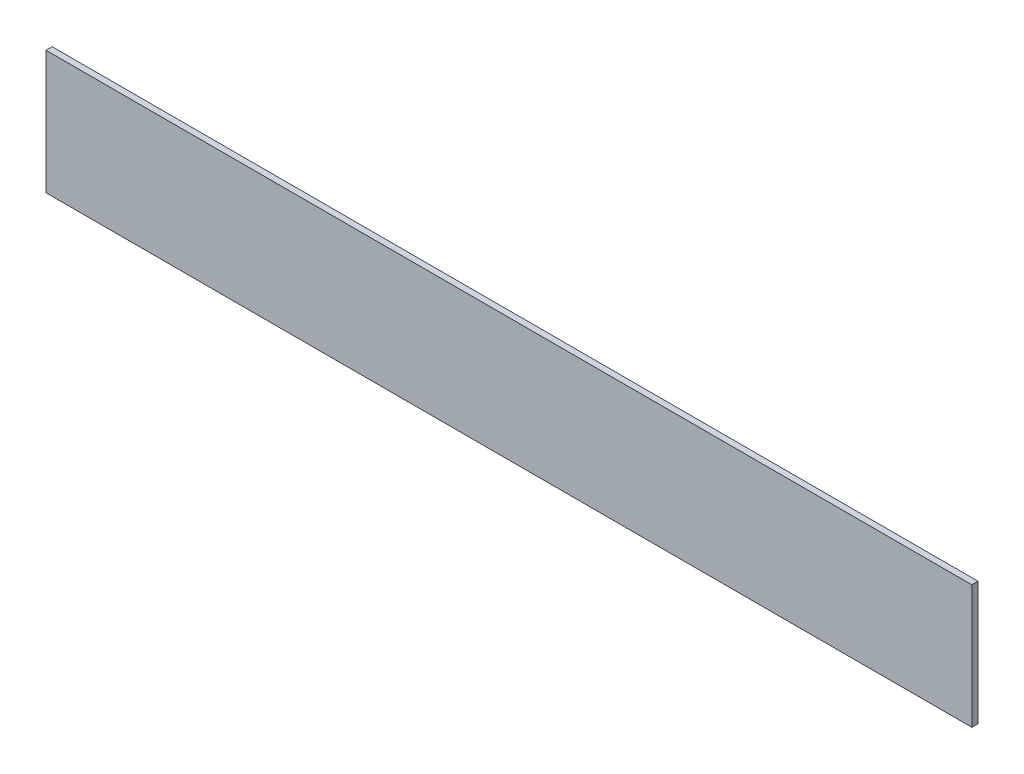
ISO-10303-21;
HEADER;
FILE_DESCRIPTION(('STEP AP214'),'2;1');
FILE_NAME('part.step','',(''),(''),'','','');
FILE_SCHEMA(('AUTOMOTIVE_DESIGN { 1 0 10303 214 1 1 1 1 }'));
ENDSEC;
DATA;
#1=APPLICATION_CONTEXT('core data for automotive mechanical design processes');
#2=APPLICATION_PROTOCOL_DEFINITION('international standard','automotive_design',2000,#1);
#3=PRODUCT_CONTEXT('',#1,'mechanical');
#4=PRODUCT('Part','Part','',(#3));
#5=PRODUCT_RELATED_PRODUCT_CATEGORY('part','',(#4));
#6=PRODUCT_DEFINITION_FORMATION('','',#4);
#7=PRODUCT_DEFINITION_CONTEXT('part definition',#1,'design');
#8=PRODUCT_DEFINITION('design','',#6,#7);
#9=PRODUCT_DEFINITION_SHAPE('','',#8);
#10=(LENGTH_UNIT() NAMED_UNIT(*) SI_UNIT(.MILLI.,.METRE.));
#11=(NAMED_UNIT(*) PLANE_ANGLE_UNIT() SI_UNIT($,.RADIAN.));
#12=(NAMED_UNIT(*) SI_UNIT($,.STERADIAN.) SOLID_ANGLE_UNIT());
#13=UNCERTAINTY_MEASURE_WITH_UNIT(LENGTH_MEASURE(1.E-05),#10,'distance_accuracy_value','');
#14=(GEOMETRIC_REPRESENTATION_CONTEXT(3) GLOBAL_UNCERTAINTY_ASSIGNED_CONTEXT((#13)) GLOBAL_UNIT_ASSIGNED_CONTEXT((#10,
#11,#12)) REPRESENTATION_CONTEXT('',''));
#15=CARTESIAN_POINT('',(0.,0.,0.));
#16=DIRECTION('',(0.,0.,1.));
#17=DIRECTION('',(1.,0.,0.));
#18=AXIS2_PLACEMENT_3D('',#15,#16,#17);
#19=CARTESIAN_POINT('',(150.,-20.,-1.));
#20=DIRECTION('',(1.,0.,0.));
#21=DIRECTION('',(0.,0.,-1.));
#22=AXIS2_PLACEMENT_3D('',#19,#20,#21);
#23=PLANE('',#22);
#24=DIRECTION('',(0.,0.,1.));
#25=VECTOR('',#24,1.);
#26=CARTESIAN_POINT('',(150.,20.,-1.));
#27=LINE('',#26,#25);
#28=CARTESIAN_POINT('',(150.,20.,-1.));
#29=VERTEX_POINT('',#28);
#30=CARTESIAN_POINT('',(150.,20.,1.));
#31=VERTEX_POINT('',#30);
#32=EDGE_CURVE('E40',#29,#31,#27,.T.);
#33=ORIENTED_EDGE('',*,*,#32,.T.);
#34=DIRECTION('',(0.,1.,0.));
#35=VECTOR('',#34,1.);
#36=CARTESIAN_POINT('',(150.,-20.,1.));
#37=LINE('',#36,#35);
#38=CARTESIAN_POINT('',(150.,-20.,1.));
#39=VERTEX_POINT('',#38);
#40=EDGE_CURVE('E77',#39,#31,#37,.T.);
#41=ORIENTED_EDGE('',*,*,#40,.F.);
#42=DIRECTION('',(0.,0.,1.));
#43=VECTOR('',#42,1.);
#44=CARTESIAN_POINT('',(150.,-20.,-1.));
#45=LINE('',#44,#43);
#46=CARTESIAN_POINT('',(150.,-20.,-1.));
#47=VERTEX_POINT('',#46);
#48=EDGE_CURVE('E11',#47,#39,#45,.T.);
#49=ORIENTED_EDGE('',*,*,#48,.F.);
#50=DIRECTION('',(0.,1.,0.));
#51=VECTOR('',#50,1.);
#52=CARTESIAN_POINT('',(150.,-20.,-1.));
#53=LINE('',#52,#51);
#54=EDGE_CURVE('E78',#47,#29,#53,.T.);
#55=ORIENTED_EDGE('',*,*,#54,.T.);
#56=EDGE_LOOP('',(#33,#41,#49,#55));
#57=FACE_BOUND('',#56,.T.);
#58=ADVANCED_FACE('F37',(#57),#23,.T.);
#59=CARTESIAN_POINT('',(-150.,-20.,-1.));
#60=DIRECTION('',(0.,-1.,0.));
#61=DIRECTION('',(0.,0.,-1.));
#62=AXIS2_PLACEMENT_3D('',#59,#60,#61);
#63=PLANE('',#62);
#64=ORIENTED_EDGE('',*,*,#48,.T.);
#65=DIRECTION('',(1.,0.,0.));
#66=VECTOR('',#65,1.);
#67=CARTESIAN_POINT('',(-150.,-20.,1.));
#68=LINE('',#67,#66);
#69=CARTESIAN_POINT('',(-150.,-20.,1.));
#70=VERTEX_POINT('',#69);
#71=EDGE_CURVE('E94',#70,#39,#68,.T.);
#72=ORIENTED_EDGE('',*,*,#71,.F.);
#73=DIRECTION('',(0.,0.,1.));
#74=VECTOR('',#73,1.);
#75=CARTESIAN_POINT('',(-150.,-20.,-1.));
#76=LINE('',#75,#74);
#77=CARTESIAN_POINT('',(-150.,-20.,-1.));
#78=VERTEX_POINT('',#77);
#79=EDGE_CURVE('E45',#78,#70,#76,.T.);
#80=ORIENTED_EDGE('',*,*,#79,.F.);
#81=DIRECTION('',(1.,0.,0.));
#82=VECTOR('',#81,1.);
#83=CARTESIAN_POINT('',(-150.,-20.,-1.));
#84=LINE('',#83,#82);
#85=EDGE_CURVE('E83',#78,#47,#84,.T.);
#86=ORIENTED_EDGE('',*,*,#85,.T.);
#87=EDGE_LOOP('',(#64,#72,#80,#86));
#88=FACE_BOUND('',#87,.T.);
#89=ADVANCED_FACE('F109',(#88),#63,.T.);
#90=CARTESIAN_POINT('',(-150.,-20.,-1.));
#91=DIRECTION('',(-1.,0.,0.));
#92=DIRECTION('',(0.,0.,1.));
#93=AXIS2_PLACEMENT_3D('',#90,#91,#92);
#94=PLANE('',#93);
#95=ORIENTED_EDGE('',*,*,#79,.T.);
#96=DIRECTION('',(0.,-1.,0.));
#97=VECTOR('',#96,1.);
#98=CARTESIAN_POINT('',(-150.,-20.,1.));
#99=LINE('',#98,#97);
#100=CARTESIAN_POINT('',(-150.,20.,1.));
#101=VERTEX_POINT('',#100);
#102=EDGE_CURVE('E90',#101,#70,#99,.T.);
#103=ORIENTED_EDGE('',*,*,#102,.F.);
#104=DIRECTION('',(0.,0.,1.));
#105=VECTOR('',#104,1.);
#106=CARTESIAN_POINT('',(-150.,20.,-1.));
#107=LINE('',#106,#105);
#108=CARTESIAN_POINT('',(-150.,20.,-1.));
#109=VERTEX_POINT('',#108);
#110=EDGE_CURVE('E82',#109,#101,#107,.T.);
#111=ORIENTED_EDGE('',*,*,#110,.F.);
#112=DIRECTION('',(0.,-1.,0.));
#113=VECTOR('',#112,1.);
#114=CARTESIAN_POINT('',(-150.,-20.,-1.));
#115=LINE('',#114,#113);
#116=EDGE_CURVE('E102',#109,#78,#115,.T.);
#117=ORIENTED_EDGE('',*,*,#116,.T.);
#118=EDGE_LOOP('',(#95,#103,#111,#117));
#119=FACE_BOUND('',#118,.T.);
#120=ADVANCED_FACE('F106',(#119),#94,.T.);
#121=CARTESIAN_POINT('',(-150.,20.,-1.));
#122=DIRECTION('',(0.,1.,0.));
#123=DIRECTION('',(0.,0.,1.));
#124=AXIS2_PLACEMENT_3D('',#121,#122,#123);
#125=PLANE('',#124);
#126=ORIENTED_EDGE('',*,*,#110,.T.);
#127=DIRECTION('',(-1.,0.,0.));
#128=VECTOR('',#127,1.);
#129=CARTESIAN_POINT('',(-150.,20.,1.));
#130=LINE('',#129,#128);
#131=EDGE_CURVE('E85',#31,#101,#130,.T.);
#132=ORIENTED_EDGE('',*,*,#131,.F.);
#133=ORIENTED_EDGE('',*,*,#32,.F.);
#134=DIRECTION('',(-1.,0.,0.));
#135=VECTOR('',#134,1.);
#136=CARTESIAN_POINT('',(-150.,20.,-1.));
#137=LINE('',#136,#135);
#138=EDGE_CURVE('E100',#29,#109,#137,.T.);
#139=ORIENTED_EDGE('',*,*,#138,.T.);
#140=EDGE_LOOP('',(#126,#132,#133,#139));
#141=FACE_BOUND('',#140,.T.);
#142=ADVANCED_FACE('F86',(#141),#125,.T.);
#143=CARTESIAN_POINT('',(0.,0.,-1.));
#144=DIRECTION('',(0.,0.,-1.));
#145=DIRECTION('',(-1.,0.,0.));
#146=AXIS2_PLACEMENT_3D('',#143,#144,#145);
#147=PLANE('',#146);
#148=ORIENTED_EDGE('',*,*,#54,.F.);
#149=ORIENTED_EDGE('',*,*,#85,.F.);
#150=ORIENTED_EDGE('',*,*,#116,.F.);
#151=ORIENTED_EDGE('',*,*,#138,.F.);
#152=EDGE_LOOP('',(#148,#149,#150,#151));
#153=FACE_BOUND('',#152,.T.);
#154=ADVANCED_FACE('F111',(#153),#147,.T.);
#155=CARTESIAN_POINT('',(0.,0.,1.));
#156=DIRECTION('',(0.,0.,-1.));
#157=DIRECTION('',(-1.,0.,0.));
#158=AXIS2_PLACEMENT_3D('',#155,#156,#157);
#159=PLANE('',#158);
#160=ORIENTED_EDGE('',*,*,#40,.T.);
#161=ORIENTED_EDGE('',*,*,#131,.T.);
#162=ORIENTED_EDGE('',*,*,#102,.T.);
#163=ORIENTED_EDGE('',*,*,#71,.T.);
#164=EDGE_LOOP('',(#160,#161,#162,#163));
#165=FACE_BOUND('',#164,.T.);
#166=ADVANCED_FACE('F93',(#165),#159,.F.);
#167=CLOSED_SHELL('',(#58,#89,#120,#142,#154,#166));
#168=MANIFOLD_SOLID_BREP('B2',#167);
#169=ADVANCED_BREP_SHAPE_REPRESENTATION('',(#18,#168),#14);
#170=SHAPE_DEFINITION_REPRESENTATION(#9,#169);
ENDSEC;
END-ISO-10303-21;
